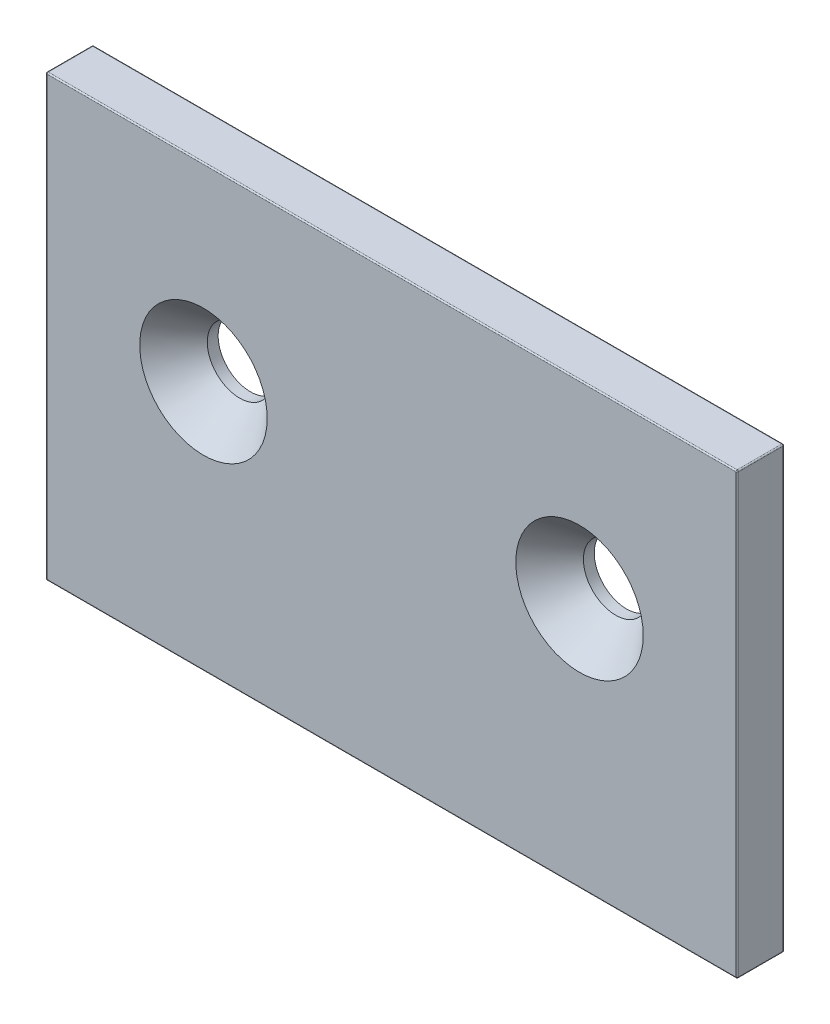
ISO-10303-21;
HEADER;
FILE_DESCRIPTION(('STEP AP214'),'2;1');
FILE_NAME('part.step','',(''),(''),'','','');
FILE_SCHEMA(('AUTOMOTIVE_DESIGN { 1 0 10303 214 1 1 1 1 }'));
ENDSEC;
DATA;
#1=APPLICATION_CONTEXT('core data for automotive mechanical design processes');
#2=APPLICATION_PROTOCOL_DEFINITION('international standard','automotive_design',2000,#1);
#3=PRODUCT_CONTEXT('',#1,'mechanical');
#4=PRODUCT('Part','Part','',(#3));
#5=PRODUCT_RELATED_PRODUCT_CATEGORY('part','',(#4));
#6=PRODUCT_DEFINITION_FORMATION('','',#4);
#7=PRODUCT_DEFINITION_CONTEXT('part definition',#1,'design');
#8=PRODUCT_DEFINITION('design','',#6,#7);
#9=PRODUCT_DEFINITION_SHAPE('','',#8);
#10=(LENGTH_UNIT() NAMED_UNIT(*) SI_UNIT(.MILLI.,.METRE.));
#11=(NAMED_UNIT(*) PLANE_ANGLE_UNIT() SI_UNIT($,.RADIAN.));
#12=(NAMED_UNIT(*) SI_UNIT($,.STERADIAN.) SOLID_ANGLE_UNIT());
#13=UNCERTAINTY_MEASURE_WITH_UNIT(LENGTH_MEASURE(1.E-05),#10,'distance_accuracy_value','');
#14=(GEOMETRIC_REPRESENTATION_CONTEXT(3) GLOBAL_UNCERTAINTY_ASSIGNED_CONTEXT((#13)) GLOBAL_UNIT_ASSIGNED_CONTEXT((#10,
#11,#12)) REPRESENTATION_CONTEXT('',''));
#15=CARTESIAN_POINT('',(0.,0.,0.));
#16=DIRECTION('',(0.,0.,1.));
#17=DIRECTION('',(1.,0.,0.));
#18=AXIS2_PLACEMENT_3D('',#15,#16,#17);
#19=CARTESIAN_POINT('',(-34.925,0.,2.3749));
#20=DIRECTION('',(1.,0.,0.));
#21=DIRECTION('',(0.,0.,-1.));
#22=AXIS2_PLACEMENT_3D('',#19,#20,#21);
#23=PLANE('',#22);
#24=DIRECTION('',(0.,-1.,0.));
#25=VECTOR('',#24,1.);
#26=CARTESIAN_POINT('',(-34.925,0.,2.2479));
#27=LINE('',#26,#25);
#28=CARTESIAN_POINT('',(-34.925,0.127,2.2479));
#29=VERTEX_POINT('',#28);
#30=CARTESIAN_POINT('',(-34.925,44.323,2.2479));
#31=VERTEX_POINT('',#30);
#32=EDGE_CURVE('E189',#29,#31,#27,.F.);
#33=ORIENTED_EDGE('',*,*,#32,.T.);
#34=DIRECTION('',(0.,0.,-1.));
#35=VECTOR('',#34,1.);
#36=CARTESIAN_POINT('',(-34.925,44.323,2.3749));
#37=LINE('',#36,#35);
#38=CARTESIAN_POINT('',(-34.925,44.323,-2.2479));
#39=VERTEX_POINT('',#38);
#40=EDGE_CURVE('E191',#31,#39,#37,.T.);
#41=ORIENTED_EDGE('',*,*,#40,.T.);
#42=DIRECTION('',(0.,-1.,0.));
#43=VECTOR('',#42,1.);
#44=CARTESIAN_POINT('',(-34.925,0.,-2.2479));
#45=LINE('',#44,#43);
#46=CARTESIAN_POINT('',(-34.925,0.127,-2.2479));
#47=VERTEX_POINT('',#46);
#48=EDGE_CURVE('E187',#39,#47,#45,.T.);
#49=ORIENTED_EDGE('',*,*,#48,.T.);
#50=DIRECTION('',(0.,0.,-1.));
#51=VECTOR('',#50,1.);
#52=CARTESIAN_POINT('',(-34.925,0.127,2.3749));
#53=LINE('',#52,#51);
#54=EDGE_CURVE('E185',#47,#29,#53,.F.);
#55=ORIENTED_EDGE('',*,*,#54,.T.);
#56=EDGE_LOOP('',(#33,#41,#49,#55));
#57=FACE_BOUND('',#56,.T.);
#58=ADVANCED_FACE('F33',(#57),#23,.F.);
#59=CARTESIAN_POINT('',(-34.925,0.,2.3749));
#60=DIRECTION('',(0.,1.,0.));
#61=DIRECTION('',(0.,0.,1.));
#62=AXIS2_PLACEMENT_3D('',#59,#60,#61);
#63=PLANE('',#62);
#64=DIRECTION('',(1.,0.,0.));
#65=VECTOR('',#64,1.);
#66=CARTESIAN_POINT('',(-34.925,0.,2.2479));
#67=LINE('',#66,#65);
#68=CARTESIAN_POINT('',(34.798,0.,2.2479));
#69=VERTEX_POINT('',#68);
#70=CARTESIAN_POINT('',(-34.798,0.,2.2479));
#71=VERTEX_POINT('',#70);
#72=EDGE_CURVE('E139',#69,#71,#67,.F.);
#73=ORIENTED_EDGE('',*,*,#72,.T.);
#74=DIRECTION('',(0.,0.,-1.));
#75=VECTOR('',#74,1.);
#76=CARTESIAN_POINT('',(-34.798,0.,2.3749));
#77=LINE('',#76,#75);
#78=CARTESIAN_POINT('',(-34.798,0.,-2.2479));
#79=VERTEX_POINT('',#78);
#80=EDGE_CURVE('E199',#71,#79,#77,.T.);
#81=ORIENTED_EDGE('',*,*,#80,.T.);
#82=DIRECTION('',(1.,0.,0.));
#83=VECTOR('',#82,1.);
#84=CARTESIAN_POINT('',(34.925,0.,-2.2479));
#85=LINE('',#84,#83);
#86=CARTESIAN_POINT('',(34.798,0.,-2.2479));
#87=VERTEX_POINT('',#86);
#88=EDGE_CURVE('E196',#79,#87,#85,.T.);
#89=ORIENTED_EDGE('',*,*,#88,.T.);
#90=DIRECTION('',(0.,0.,-1.));
#91=VECTOR('',#90,1.);
#92=CARTESIAN_POINT('',(34.798,0.,2.3749));
#93=LINE('',#92,#91);
#94=EDGE_CURVE('E194',#87,#69,#93,.F.);
#95=ORIENTED_EDGE('',*,*,#94,.T.);
#96=EDGE_LOOP('',(#73,#81,#89,#95));
#97=FACE_BOUND('',#96,.T.);
#98=ADVANCED_FACE('F305',(#97),#63,.F.);
#99=CARTESIAN_POINT('',(34.925,0.,2.3749));
#100=DIRECTION('',(-1.,0.,0.));
#101=DIRECTION('',(0.,0.,1.));
#102=AXIS2_PLACEMENT_3D('',#99,#100,#101);
#103=PLANE('',#102);
#104=DIRECTION('',(0.,1.,0.));
#105=VECTOR('',#104,1.);
#106=CARTESIAN_POINT('',(34.925,0.,2.2479));
#107=LINE('',#106,#105);
#108=CARTESIAN_POINT('',(34.925,44.323,2.2479));
#109=VERTEX_POINT('',#108);
#110=CARTESIAN_POINT('',(34.925,0.127,2.2479));
#111=VERTEX_POINT('',#110);
#112=EDGE_CURVE('E42',#109,#111,#107,.F.);
#113=ORIENTED_EDGE('',*,*,#112,.T.);
#114=DIRECTION('',(0.,0.,-1.));
#115=VECTOR('',#114,1.);
#116=CARTESIAN_POINT('',(34.925,0.127,2.3749));
#117=LINE('',#116,#115);
#118=CARTESIAN_POINT('',(34.925,0.127,-2.2479));
#119=VERTEX_POINT('',#118);
#120=EDGE_CURVE('E11',#111,#119,#117,.T.);
#121=ORIENTED_EDGE('',*,*,#120,.T.);
#122=DIRECTION('',(0.,1.,0.));
#123=VECTOR('',#122,1.);
#124=CARTESIAN_POINT('',(34.925,44.45,-2.2479));
#125=LINE('',#124,#123);
#126=CARTESIAN_POINT('',(34.925,44.323,-2.2479));
#127=VERTEX_POINT('',#126);
#128=EDGE_CURVE('E202',#119,#127,#125,.T.);
#129=ORIENTED_EDGE('',*,*,#128,.T.);
#130=DIRECTION('',(0.,0.,-1.));
#131=VECTOR('',#130,1.);
#132=CARTESIAN_POINT('',(34.925,44.323,2.3749));
#133=LINE('',#132,#131);
#134=EDGE_CURVE('E53',#127,#109,#133,.F.);
#135=ORIENTED_EDGE('',*,*,#134,.T.);
#136=EDGE_LOOP('',(#113,#121,#129,#135));
#137=FACE_BOUND('',#136,.T.);
#138=ADVANCED_FACE('F300',(#137),#103,.F.);
#139=CARTESIAN_POINT('',(-34.925,44.45,2.3749));
#140=DIRECTION('',(0.,-1.,0.));
#141=DIRECTION('',(0.,0.,-1.));
#142=AXIS2_PLACEMENT_3D('',#139,#140,#141);
#143=PLANE('',#142);
#144=DIRECTION('',(-1.,0.,0.));
#145=VECTOR('',#144,1.);
#146=CARTESIAN_POINT('',(-34.925,44.45,-2.2479));
#147=LINE('',#146,#145);
#148=CARTESIAN_POINT('',(34.798,44.45,-2.2479));
#149=VERTEX_POINT('',#148);
#150=CARTESIAN_POINT('',(-34.798,44.45,-2.2479));
#151=VERTEX_POINT('',#150);
#152=EDGE_CURVE('E169',#149,#151,#147,.T.);
#153=ORIENTED_EDGE('',*,*,#152,.T.);
#154=DIRECTION('',(0.,0.,-1.));
#155=VECTOR('',#154,1.);
#156=CARTESIAN_POINT('',(-34.798,44.45,2.3749));
#157=LINE('',#156,#155);
#158=CARTESIAN_POINT('',(-34.798,44.45,2.2479));
#159=VERTEX_POINT('',#158);
#160=EDGE_CURVE('E174',#151,#159,#157,.F.);
#161=ORIENTED_EDGE('',*,*,#160,.T.);
#162=DIRECTION('',(-1.,0.,0.));
#163=VECTOR('',#162,1.);
#164=CARTESIAN_POINT('',(-34.925,44.45,2.2479));
#165=LINE('',#164,#163);
#166=CARTESIAN_POINT('',(34.798,44.45,2.2479));
#167=VERTEX_POINT('',#166);
#168=EDGE_CURVE('E171',#159,#167,#165,.F.);
#169=ORIENTED_EDGE('',*,*,#168,.T.);
#170=DIRECTION('',(0.,0.,-1.));
#171=VECTOR('',#170,1.);
#172=CARTESIAN_POINT('',(34.798,44.45,2.3749));
#173=LINE('',#172,#171);
#174=EDGE_CURVE('E167',#167,#149,#173,.T.);
#175=ORIENTED_EDGE('',*,*,#174,.T.);
#176=EDGE_LOOP('',(#153,#161,#169,#175));
#177=FACE_BOUND('',#176,.T.);
#178=ADVANCED_FACE('F292',(#177),#143,.F.);
#179=CARTESIAN_POINT('',(0.,0.,2.3749));
#180=DIRECTION('',(0.,0.,-1.));
#181=DIRECTION('',(-1.,0.,0.));
#182=AXIS2_PLACEMENT_3D('',#179,#180,#181);
#183=PLANE('',#182);
#184=DIRECTION('',(0.,1.,0.));
#185=VECTOR('',#184,1.);
#186=CARTESIAN_POINT('',(34.798,0.,2.3749));
#187=LINE('',#186,#185);
#188=CARTESIAN_POINT('',(34.798,0.127,2.3749));
#189=VERTEX_POINT('',#188);
#190=CARTESIAN_POINT('',(34.798,44.323,2.3749));
#191=VERTEX_POINT('',#190);
#192=EDGE_CURVE('E126',#189,#191,#187,.T.);
#193=ORIENTED_EDGE('',*,*,#192,.T.);
#194=DIRECTION('',(-1.,0.,0.));
#195=VECTOR('',#194,1.);
#196=CARTESIAN_POINT('',(0.,44.323,2.3749));
#197=LINE('',#196,#195);
#198=CARTESIAN_POINT('',(-34.798,44.323,2.3749));
#199=VERTEX_POINT('',#198);
#200=EDGE_CURVE('E165',#191,#199,#197,.T.);
#201=ORIENTED_EDGE('',*,*,#200,.T.);
#202=DIRECTION('',(0.,-1.,0.));
#203=VECTOR('',#202,1.);
#204=CARTESIAN_POINT('',(-34.798,0.,2.3749));
#205=LINE('',#204,#203);
#206=CARTESIAN_POINT('',(-34.798,0.127,2.3749));
#207=VERTEX_POINT('',#206);
#208=EDGE_CURVE('E129',#199,#207,#205,.T.);
#209=ORIENTED_EDGE('',*,*,#208,.T.);
#210=DIRECTION('',(1.,0.,0.));
#211=VECTOR('',#210,1.);
#212=CARTESIAN_POINT('',(0.,0.127,2.3749));
#213=LINE('',#212,#211);
#214=EDGE_CURVE('E120',#207,#189,#213,.T.);
#215=ORIENTED_EDGE('',*,*,#214,.T.);
#216=EDGE_LOOP('',(#193,#201,#209,#215));
#217=FACE_BOUND('',#216,.T.);
#218=CARTESIAN_POINT('',(-18.9987120126599,25.3151057760743,2.3749));
#219=DIRECTION('',(0.,0.,1.));
#220=DIRECTION('',(1.,0.,0.));
#221=AXIS2_PLACEMENT_3D('',#218,#219,#220);
#222=CIRCLE('',#221,6.4389);
#223=CARTESIAN_POINT('',(-12.5598120126599,25.3151057760743,2.3749));
#224=VERTEX_POINT('',#223);
#225=EDGE_CURVE('E260',#224,#224,#222,.T.);
#226=ORIENTED_EDGE('',*,*,#225,.F.);
#227=EDGE_LOOP('',(#226));
#228=FACE_BOUND('',#227,.T.);
#229=CARTESIAN_POINT('',(18.9987120126599,25.3151057760743,2.3749));
#230=DIRECTION('',(0.,0.,1.));
#231=DIRECTION('',(1.,0.,0.));
#232=AXIS2_PLACEMENT_3D('',#229,#230,#231);
#233=CIRCLE('',#232,6.4389);
#234=CARTESIAN_POINT('',(25.4376120126599,25.3151057760743,2.3749));
#235=VERTEX_POINT('',#234);
#236=EDGE_CURVE('E276',#235,#235,#233,.T.);
#237=ORIENTED_EDGE('',*,*,#236,.F.);
#238=EDGE_LOOP('',(#237));
#239=FACE_BOUND('',#238,.T.);
#240=ADVANCED_FACE('F122',(#217,#228,#239),#183,.F.);
#241=CARTESIAN_POINT('',(0.,0.,-2.3749));
#242=DIRECTION('',(0.,0.,-1.));
#243=DIRECTION('',(-1.,0.,0.));
#244=AXIS2_PLACEMENT_3D('',#241,#242,#243);
#245=PLANE('',#244);
#246=DIRECTION('',(0.,-1.,0.));
#247=VECTOR('',#246,1.);
#248=CARTESIAN_POINT('',(-34.798,44.45,-2.3749));
#249=LINE('',#248,#247);
#250=CARTESIAN_POINT('',(-34.798,0.127,-2.3749));
#251=VERTEX_POINT('',#250);
#252=CARTESIAN_POINT('',(-34.798,44.323,-2.3749));
#253=VERTEX_POINT('',#252);
#254=EDGE_CURVE('E180',#251,#253,#249,.F.);
#255=ORIENTED_EDGE('',*,*,#254,.T.);
#256=DIRECTION('',(-1.,0.,0.));
#257=VECTOR('',#256,1.);
#258=CARTESIAN_POINT('',(34.925,44.323,-2.3749));
#259=LINE('',#258,#257);
#260=CARTESIAN_POINT('',(34.798,44.323,-2.3749));
#261=VERTEX_POINT('',#260);
#262=EDGE_CURVE('E182',#253,#261,#259,.F.);
#263=ORIENTED_EDGE('',*,*,#262,.T.);
#264=DIRECTION('',(0.,1.,0.));
#265=VECTOR('',#264,1.);
#266=CARTESIAN_POINT('',(34.798,0.,-2.3749));
#267=LINE('',#266,#265);
#268=CARTESIAN_POINT('',(34.798,0.127,-2.3749));
#269=VERTEX_POINT('',#268);
#270=EDGE_CURVE('E176',#261,#269,#267,.F.);
#271=ORIENTED_EDGE('',*,*,#270,.T.);
#272=DIRECTION('',(1.,0.,0.));
#273=VECTOR('',#272,1.);
#274=CARTESIAN_POINT('',(-34.925,0.127,-2.3749));
#275=LINE('',#274,#273);
#276=EDGE_CURVE('E178',#269,#251,#275,.F.);
#277=ORIENTED_EDGE('',*,*,#276,.T.);
#278=EDGE_LOOP('',(#255,#263,#271,#277));
#279=FACE_BOUND('',#278,.T.);
#280=CARTESIAN_POINT('',(-18.9987120126599,25.3151057760743,-2.3749));
#281=DIRECTION('',(0.,0.,1.));
#282=DIRECTION('',(1.,0.,0.));
#283=AXIS2_PLACEMENT_3D('',#280,#281,#282);
#284=CIRCLE('',#283,3.2639);
#285=CARTESIAN_POINT('',(-15.7348120126599,25.3151057760743,-2.3749));
#286=VERTEX_POINT('',#285);
#287=EDGE_CURVE('E271',#286,#286,#284,.T.);
#288=ORIENTED_EDGE('',*,*,#287,.T.);
#289=EDGE_LOOP('',(#288));
#290=FACE_BOUND('',#289,.T.);
#291=CARTESIAN_POINT('',(18.9987120126599,25.3151057760743,-2.3749));
#292=DIRECTION('',(0.,0.,1.));
#293=DIRECTION('',(1.,0.,0.));
#294=AXIS2_PLACEMENT_3D('',#291,#292,#293);
#295=CIRCLE('',#294,3.2639);
#296=CARTESIAN_POINT('',(22.2626120126599,25.3151057760743,-2.3749));
#297=VERTEX_POINT('',#296);
#298=EDGE_CURVE('E157',#297,#297,#295,.T.);
#299=ORIENTED_EDGE('',*,*,#298,.T.);
#300=EDGE_LOOP('',(#299));
#301=FACE_BOUND('',#300,.T.);
#302=ADVANCED_FACE('F291',(#279,#290,#301),#245,.T.);
#303=CARTESIAN_POINT('',(18.9987120126599,25.3151057760743,2.3749));
#304=DIRECTION('',(0.,0.,1.));
#305=DIRECTION('',(1.,0.,0.));
#306=AXIS2_PLACEMENT_3D('',#303,#304,#305);
#307=CYLINDRICAL_SURFACE('',#306,3.26389999999999);
#308=ORIENTED_EDGE('',*,*,#298,.F.);
#309=EDGE_LOOP('',(#308));
#310=FACE_BOUND('',#309,.T.);
#311=CARTESIAN_POINT('',(18.9987120126599,25.3151057760743,-1.27751969292671));
#312=DIRECTION('',(0.,0.,1.));
#313=DIRECTION('',(1.,0.,0.));
#314=AXIS2_PLACEMENT_3D('',#311,#312,#313);
#315=CIRCLE('',#314,3.26389999999999);
#316=CARTESIAN_POINT('',(22.2626120126599,25.3151057760743,-1.27751969292671));
#317=VERTEX_POINT('',#316);
#318=EDGE_CURVE('E160',#317,#317,#315,.T.);
#319=ORIENTED_EDGE('',*,*,#318,.T.);
#320=EDGE_LOOP('',(#319));
#321=FACE_BOUND('',#320,.T.);
#322=ADVANCED_FACE('F281',(#310,#321),#307,.F.);
#323=CARTESIAN_POINT('',(18.9987120126599,25.3151057760743,2.3749));
#324=DIRECTION('',(0.,0.,1.));
#325=DIRECTION('',(1.,0.,0.));
#326=AXIS2_PLACEMENT_3D('',#323,#324,#325);
#327=CONICAL_SURFACE('',#326,6.4389,0.715584993317677);
#328=ORIENTED_EDGE('',*,*,#318,.F.);
#329=EDGE_LOOP('',(#328));
#330=FACE_BOUND('',#329,.T.);
#331=ORIENTED_EDGE('',*,*,#236,.T.);
#332=EDGE_LOOP('',(#331));
#333=FACE_BOUND('',#332,.T.);
#334=ADVANCED_FACE('F283',(#330,#333),#327,.F.);
#335=CARTESIAN_POINT('',(-18.9987120126599,25.3151057760743,2.3749));
#336=DIRECTION('',(0.,0.,1.));
#337=DIRECTION('',(1.,0.,0.));
#338=AXIS2_PLACEMENT_3D('',#335,#336,#337);
#339=CYLINDRICAL_SURFACE('',#338,3.26389999999999);
#340=ORIENTED_EDGE('',*,*,#287,.F.);
#341=EDGE_LOOP('',(#340));
#342=FACE_BOUND('',#341,.T.);
#343=CARTESIAN_POINT('',(-18.9987120126599,25.3151057760743,-1.27751969292671));
#344=DIRECTION('',(0.,0.,1.));
#345=DIRECTION('',(1.,0.,0.));
#346=AXIS2_PLACEMENT_3D('',#343,#344,#345);
#347=CIRCLE('',#346,3.26389999999999);
#348=CARTESIAN_POINT('',(-15.73481201266,25.3151057760743,-1.27751969292671));
#349=VERTEX_POINT('',#348);
#350=EDGE_CURVE('E266',#349,#349,#347,.T.);
#351=ORIENTED_EDGE('',*,*,#350,.T.);
#352=EDGE_LOOP('',(#351));
#353=FACE_BOUND('',#352,.T.);
#354=ADVANCED_FACE('F286',(#342,#353),#339,.F.);
#355=CARTESIAN_POINT('',(-18.9987120126599,25.3151057760743,2.3749));
#356=DIRECTION('',(0.,0.,1.));
#357=DIRECTION('',(1.,0.,0.));
#358=AXIS2_PLACEMENT_3D('',#355,#356,#357);
#359=CONICAL_SURFACE('',#358,6.4389,0.715584993317677);
#360=ORIENTED_EDGE('',*,*,#350,.F.);
#361=EDGE_LOOP('',(#360));
#362=FACE_BOUND('',#361,.T.);
#363=ORIENTED_EDGE('',*,*,#225,.T.);
#364=EDGE_LOOP('',(#363));
#365=FACE_BOUND('',#364,.T.);
#366=ADVANCED_FACE('F385',(#362,#365),#359,.F.);
#367=CARTESIAN_POINT('',(-34.925,0.127,-2.2479));
#368=DIRECTION('',(-1.,0.,0.));
#369=DIRECTION('',(0.,0.,1.));
#370=AXIS2_PLACEMENT_3D('',#367,#368,#369);
#371=CYLINDRICAL_SURFACE('',#370,0.127);
#372=CARTESIAN_POINT('',(34.798,0.127,-2.2479));
#373=DIRECTION('',(1.,0.,0.));
#374=DIRECTION('',(0.,0.,-1.));
#375=AXIS2_PLACEMENT_3D('',#372,#373,#374);
#376=CIRCLE('',#375,0.127);
#377=EDGE_CURVE('E37',#87,#269,#376,.T.);
#378=ORIENTED_EDGE('',*,*,#377,.F.);
#379=ORIENTED_EDGE('',*,*,#88,.F.);
#380=CARTESIAN_POINT('',(-34.798,0.127,-2.2479));
#381=DIRECTION('',(-1.,0.,0.));
#382=DIRECTION('',(0.,0.,1.));
#383=AXIS2_PLACEMENT_3D('',#380,#381,#382);
#384=CIRCLE('',#383,0.127);
#385=EDGE_CURVE('E252',#251,#79,#384,.T.);
#386=ORIENTED_EDGE('',*,*,#385,.F.);
#387=ORIENTED_EDGE('',*,*,#276,.F.);
#388=EDGE_LOOP('',(#378,#379,#386,#387));
#389=FACE_BOUND('',#388,.T.);
#390=ADVANCED_FACE('F35',(#389),#371,.T.);
#391=CARTESIAN_POINT('',(34.798,0.127,-2.2479));
#392=DIRECTION('',(0.,0.,1.));
#393=DIRECTION('',(1.,0.,0.));
#394=AXIS2_PLACEMENT_3D('',#391,#392,#393);
#395=SPHERICAL_SURFACE('',#394,0.127);
#396=CARTESIAN_POINT('',(34.798,0.127,-2.2479));
#397=DIRECTION('',(0.,0.,-1.));
#398=DIRECTION('',(-1.,0.,0.));
#399=AXIS2_PLACEMENT_3D('',#396,#397,#398);
#400=CIRCLE('',#399,0.127);
#401=EDGE_CURVE('E247',#87,#119,#400,.F.);
#402=ORIENTED_EDGE('',*,*,#401,.F.);
#403=ORIENTED_EDGE('',*,*,#377,.T.);
#404=CARTESIAN_POINT('',(34.798,0.127,-2.2479));
#405=DIRECTION('',(0.,-1.,0.));
#406=DIRECTION('',(0.,0.,-1.));
#407=AXIS2_PLACEMENT_3D('',#404,#405,#406);
#408=CIRCLE('',#407,0.127);
#409=EDGE_CURVE('E250',#119,#269,#408,.F.);
#410=ORIENTED_EDGE('',*,*,#409,.F.);
#411=EDGE_LOOP('',(#402,#403,#410));
#412=FACE_BOUND('',#411,.T.);
#413=ADVANCED_FACE('F380',(#412),#395,.T.);
#414=CARTESIAN_POINT('',(-34.798,0.127,-2.2479));
#415=DIRECTION('',(0.,0.,1.));
#416=DIRECTION('',(1.,0.,0.));
#417=AXIS2_PLACEMENT_3D('',#414,#415,#416);
#418=SPHERICAL_SURFACE('',#417,0.127);
#419=CARTESIAN_POINT('',(-34.798,0.127,-2.2479));
#420=DIRECTION('',(0.,-1.,0.));
#421=DIRECTION('',(0.,0.,-1.));
#422=AXIS2_PLACEMENT_3D('',#419,#420,#421);
#423=CIRCLE('',#422,0.127);
#424=EDGE_CURVE('E242',#251,#47,#423,.F.);
#425=ORIENTED_EDGE('',*,*,#424,.F.);
#426=ORIENTED_EDGE('',*,*,#385,.T.);
#427=CARTESIAN_POINT('',(-34.798,0.127,-2.2479));
#428=DIRECTION('',(0.,0.,-1.));
#429=DIRECTION('',(-1.,0.,0.));
#430=AXIS2_PLACEMENT_3D('',#427,#428,#429);
#431=CIRCLE('',#430,0.127);
#432=EDGE_CURVE('E245',#47,#79,#431,.F.);
#433=ORIENTED_EDGE('',*,*,#432,.F.);
#434=EDGE_LOOP('',(#425,#426,#433));
#435=FACE_BOUND('',#434,.T.);
#436=ADVANCED_FACE('F377',(#435),#418,.T.);
#437=CARTESIAN_POINT('',(34.798,0.,-2.2479));
#438=DIRECTION('',(0.,-1.,0.));
#439=DIRECTION('',(0.,0.,-1.));
#440=AXIS2_PLACEMENT_3D('',#437,#438,#439);
#441=CYLINDRICAL_SURFACE('',#440,0.127);
#442=ORIENTED_EDGE('',*,*,#409,.T.);
#443=ORIENTED_EDGE('',*,*,#270,.F.);
#444=CARTESIAN_POINT('',(34.798,44.323,-2.2479));
#445=DIRECTION('',(0.,1.,0.));
#446=DIRECTION('',(0.,0.,1.));
#447=AXIS2_PLACEMENT_3D('',#444,#445,#446);
#448=CIRCLE('',#447,0.127);
#449=EDGE_CURVE('E237',#127,#261,#448,.T.);
#450=ORIENTED_EDGE('',*,*,#449,.F.);
#451=ORIENTED_EDGE('',*,*,#128,.F.);
#452=EDGE_LOOP('',(#442,#443,#450,#451));
#453=FACE_BOUND('',#452,.T.);
#454=ADVANCED_FACE('F373',(#453),#441,.T.);
#455=CARTESIAN_POINT('',(34.798,0.127,2.3749));
#456=DIRECTION('',(0.,0.,-1.));
#457=DIRECTION('',(-1.,0.,0.));
#458=AXIS2_PLACEMENT_3D('',#455,#456,#457);
#459=CYLINDRICAL_SURFACE('',#458,0.127);
#460=ORIENTED_EDGE('',*,*,#401,.T.);
#461=ORIENTED_EDGE('',*,*,#120,.F.);
#462=CARTESIAN_POINT('',(34.798,0.127,2.2479));
#463=DIRECTION('',(0.,0.,1.));
#464=DIRECTION('',(1.,0.,0.));
#465=AXIS2_PLACEMENT_3D('',#462,#463,#464);
#466=CIRCLE('',#465,0.127);
#467=EDGE_CURVE('E143',#69,#111,#466,.T.);
#468=ORIENTED_EDGE('',*,*,#467,.F.);
#469=ORIENTED_EDGE('',*,*,#94,.F.);
#470=EDGE_LOOP('',(#460,#461,#468,#469));
#471=FACE_BOUND('',#470,.T.);
#472=ADVANCED_FACE('F370',(#471),#459,.T.);
#473=CARTESIAN_POINT('',(0.,0.127,2.2479));
#474=DIRECTION('',(1.,0.,0.));
#475=DIRECTION('',(0.,0.,-1.));
#476=AXIS2_PLACEMENT_3D('',#473,#474,#475);
#477=CYLINDRICAL_SURFACE('',#476,0.127);
#478=CARTESIAN_POINT('',(-34.798,0.127,2.2479));
#479=DIRECTION('',(-1.,0.,0.));
#480=DIRECTION('',(0.,0.,1.));
#481=AXIS2_PLACEMENT_3D('',#478,#479,#480);
#482=CIRCLE('',#481,0.127);
#483=EDGE_CURVE('E144',#71,#207,#482,.T.);
#484=ORIENTED_EDGE('',*,*,#483,.F.);
#485=ORIENTED_EDGE('',*,*,#72,.F.);
#486=CARTESIAN_POINT('',(34.798,0.127,2.2479));
#487=DIRECTION('',(1.,0.,0.));
#488=DIRECTION('',(0.,0.,-1.));
#489=AXIS2_PLACEMENT_3D('',#486,#487,#488);
#490=CIRCLE('',#489,0.127);
#491=EDGE_CURVE('E136',#189,#69,#490,.T.);
#492=ORIENTED_EDGE('',*,*,#491,.F.);
#493=ORIENTED_EDGE('',*,*,#214,.F.);
#494=EDGE_LOOP('',(#484,#485,#492,#493));
#495=FACE_BOUND('',#494,.T.);
#496=ADVANCED_FACE('F138',(#495),#477,.T.);
#497=CARTESIAN_POINT('',(-34.798,0.127,2.3749));
#498=DIRECTION('',(0.,0.,-1.));
#499=DIRECTION('',(-1.,0.,0.));
#500=AXIS2_PLACEMENT_3D('',#497,#498,#499);
#501=CYLINDRICAL_SURFACE('',#500,0.127);
#502=ORIENTED_EDGE('',*,*,#432,.T.);
#503=ORIENTED_EDGE('',*,*,#80,.F.);
#504=CARTESIAN_POINT('',(-34.798,0.127,2.2479));
#505=DIRECTION('',(0.,0.,1.));
#506=DIRECTION('',(1.,0.,0.));
#507=AXIS2_PLACEMENT_3D('',#504,#505,#506);
#508=CIRCLE('',#507,0.127);
#509=EDGE_CURVE('E232',#29,#71,#508,.T.);
#510=ORIENTED_EDGE('',*,*,#509,.F.);
#511=ORIENTED_EDGE('',*,*,#54,.F.);
#512=EDGE_LOOP('',(#502,#503,#510,#511));
#513=FACE_BOUND('',#512,.T.);
#514=ADVANCED_FACE('F363',(#513),#501,.T.);
#515=CARTESIAN_POINT('',(-34.798,0.,-2.2479));
#516=DIRECTION('',(0.,1.,0.));
#517=DIRECTION('',(0.,0.,1.));
#518=AXIS2_PLACEMENT_3D('',#515,#516,#517);
#519=CYLINDRICAL_SURFACE('',#518,0.127);
#520=ORIENTED_EDGE('',*,*,#424,.T.);
#521=ORIENTED_EDGE('',*,*,#48,.F.);
#522=CARTESIAN_POINT('',(-34.798,44.323,-2.2479));
#523=DIRECTION('',(0.,1.,0.));
#524=DIRECTION('',(0.,0.,1.));
#525=AXIS2_PLACEMENT_3D('',#522,#523,#524);
#526=CIRCLE('',#525,0.127);
#527=EDGE_CURVE('E229',#253,#39,#526,.T.);
#528=ORIENTED_EDGE('',*,*,#527,.F.);
#529=ORIENTED_EDGE('',*,*,#254,.F.);
#530=EDGE_LOOP('',(#520,#521,#528,#529));
#531=FACE_BOUND('',#530,.T.);
#532=ADVANCED_FACE('F359',(#531),#519,.T.);
#533=CARTESIAN_POINT('',(-34.925,44.323,-2.2479));
#534=DIRECTION('',(1.,0.,0.));
#535=DIRECTION('',(0.,0.,-1.));
#536=AXIS2_PLACEMENT_3D('',#533,#534,#535);
#537=CYLINDRICAL_SURFACE('',#536,0.127);
#538=CARTESIAN_POINT('',(34.798,44.323,-2.2479));
#539=DIRECTION('',(1.,0.,0.));
#540=DIRECTION('',(0.,0.,-1.));
#541=AXIS2_PLACEMENT_3D('',#538,#539,#540);
#542=CIRCLE('',#541,0.127);
#543=EDGE_CURVE('E239',#261,#149,#542,.T.);
#544=ORIENTED_EDGE('',*,*,#543,.F.);
#545=ORIENTED_EDGE('',*,*,#262,.F.);
#546=CARTESIAN_POINT('',(-34.798,44.323,-2.2479));
#547=DIRECTION('',(-1.,0.,0.));
#548=DIRECTION('',(0.,0.,1.));
#549=AXIS2_PLACEMENT_3D('',#546,#547,#548);
#550=CIRCLE('',#549,0.127);
#551=EDGE_CURVE('E226',#151,#253,#550,.T.);
#552=ORIENTED_EDGE('',*,*,#551,.F.);
#553=ORIENTED_EDGE('',*,*,#152,.F.);
#554=EDGE_LOOP('',(#544,#545,#552,#553));
#555=FACE_BOUND('',#554,.T.);
#556=ADVANCED_FACE('F355',(#555),#537,.T.);
#557=CARTESIAN_POINT('',(34.798,44.323,-2.2479));
#558=DIRECTION('',(0.,0.,1.));
#559=DIRECTION('',(1.,0.,0.));
#560=AXIS2_PLACEMENT_3D('',#557,#558,#559);
#561=SPHERICAL_SURFACE('',#560,0.127);
#562=ORIENTED_EDGE('',*,*,#449,.T.);
#563=ORIENTED_EDGE('',*,*,#543,.T.);
#564=CARTESIAN_POINT('',(34.798,44.323,-2.2479));
#565=DIRECTION('',(0.,0.,-1.));
#566=DIRECTION('',(-1.,0.,0.));
#567=AXIS2_PLACEMENT_3D('',#564,#565,#566);
#568=CIRCLE('',#567,0.127);
#569=EDGE_CURVE('E150',#127,#149,#568,.F.);
#570=ORIENTED_EDGE('',*,*,#569,.F.);
#571=EDGE_LOOP('',(#562,#563,#570));
#572=FACE_BOUND('',#571,.T.);
#573=ADVANCED_FACE('F352',(#572),#561,.T.);
#574=CARTESIAN_POINT('',(34.798,0.127,2.2479));
#575=DIRECTION('',(0.,0.,1.));
#576=DIRECTION('',(1.,0.,0.));
#577=AXIS2_PLACEMENT_3D('',#574,#575,#576);
#578=SPHERICAL_SURFACE('',#577,0.127);
#579=ORIENTED_EDGE('',*,*,#491,.T.);
#580=ORIENTED_EDGE('',*,*,#467,.T.);
#581=CARTESIAN_POINT('',(34.798,0.127,2.2479));
#582=DIRECTION('',(0.,-1.,0.));
#583=DIRECTION('',(0.,0.,-1.));
#584=AXIS2_PLACEMENT_3D('',#581,#582,#583);
#585=CIRCLE('',#584,0.127);
#586=EDGE_CURVE('E147',#189,#111,#585,.F.);
#587=ORIENTED_EDGE('',*,*,#586,.F.);
#588=EDGE_LOOP('',(#579,#580,#587));
#589=FACE_BOUND('',#588,.T.);
#590=ADVANCED_FACE('F148',(#589),#578,.T.);
#591=CARTESIAN_POINT('',(-34.798,0.127,2.2479));
#592=DIRECTION('',(0.,0.,1.));
#593=DIRECTION('',(1.,0.,0.));
#594=AXIS2_PLACEMENT_3D('',#591,#592,#593);
#595=SPHERICAL_SURFACE('',#594,0.127);
#596=ORIENTED_EDGE('',*,*,#509,.T.);
#597=ORIENTED_EDGE('',*,*,#483,.T.);
#598=CARTESIAN_POINT('',(-34.798,0.127,2.2479));
#599=DIRECTION('',(0.,-1.,0.));
#600=DIRECTION('',(0.,0.,-1.));
#601=AXIS2_PLACEMENT_3D('',#598,#599,#600);
#602=CIRCLE('',#601,0.127);
#603=EDGE_CURVE('E151',#29,#207,#602,.F.);
#604=ORIENTED_EDGE('',*,*,#603,.F.);
#605=EDGE_LOOP('',(#596,#597,#604));
#606=FACE_BOUND('',#605,.T.);
#607=ADVANCED_FACE('F345',(#606),#595,.T.);
#608=CARTESIAN_POINT('',(-34.798,44.323,-2.2479));
#609=DIRECTION('',(0.,0.,1.));
#610=DIRECTION('',(1.,0.,0.));
#611=AXIS2_PLACEMENT_3D('',#608,#609,#610);
#612=SPHERICAL_SURFACE('',#611,0.127);
#613=ORIENTED_EDGE('',*,*,#551,.T.);
#614=ORIENTED_EDGE('',*,*,#527,.T.);
#615=CARTESIAN_POINT('',(-34.798,44.323,-2.2479));
#616=DIRECTION('',(0.,0.,-1.));
#617=DIRECTION('',(-1.,0.,0.));
#618=AXIS2_PLACEMENT_3D('',#615,#616,#617);
#619=CIRCLE('',#618,0.127);
#620=EDGE_CURVE('E220',#151,#39,#619,.F.);
#621=ORIENTED_EDGE('',*,*,#620,.F.);
#622=EDGE_LOOP('',(#613,#614,#621));
#623=FACE_BOUND('',#622,.T.);
#624=ADVANCED_FACE('F341',(#623),#612,.T.);
#625=CARTESIAN_POINT('',(34.798,44.323,2.3749));
#626=DIRECTION('',(0.,0.,-1.));
#627=DIRECTION('',(-1.,0.,0.));
#628=AXIS2_PLACEMENT_3D('',#625,#626,#627);
#629=CYLINDRICAL_SURFACE('',#628,0.127);
#630=ORIENTED_EDGE('',*,*,#569,.T.);
#631=ORIENTED_EDGE('',*,*,#174,.F.);
#632=CARTESIAN_POINT('',(34.798,44.323,2.2479));
#633=DIRECTION('',(0.,0.,1.));
#634=DIRECTION('',(1.,0.,0.));
#635=AXIS2_PLACEMENT_3D('',#632,#633,#634);
#636=CIRCLE('',#635,0.127);
#637=EDGE_CURVE('E217',#109,#167,#636,.T.);
#638=ORIENTED_EDGE('',*,*,#637,.F.);
#639=ORIENTED_EDGE('',*,*,#134,.F.);
#640=EDGE_LOOP('',(#630,#631,#638,#639));
#641=FACE_BOUND('',#640,.T.);
#642=ADVANCED_FACE('F338',(#641),#629,.T.);
#643=CARTESIAN_POINT('',(34.798,0.,2.2479));
#644=DIRECTION('',(0.,1.,0.));
#645=DIRECTION('',(0.,0.,1.));
#646=AXIS2_PLACEMENT_3D('',#643,#644,#645);
#647=CYLINDRICAL_SURFACE('',#646,0.127);
#648=ORIENTED_EDGE('',*,*,#586,.T.);
#649=ORIENTED_EDGE('',*,*,#112,.F.);
#650=CARTESIAN_POINT('',(34.798,44.323,2.2479));
#651=DIRECTION('',(0.,1.,0.));
#652=DIRECTION('',(0.,0.,1.));
#653=AXIS2_PLACEMENT_3D('',#650,#651,#652);
#654=CIRCLE('',#653,0.127);
#655=EDGE_CURVE('E155',#191,#109,#654,.T.);
#656=ORIENTED_EDGE('',*,*,#655,.F.);
#657=ORIENTED_EDGE('',*,*,#192,.F.);
#658=EDGE_LOOP('',(#648,#649,#656,#657));
#659=FACE_BOUND('',#658,.T.);
#660=ADVANCED_FACE('F153',(#659),#647,.T.);
#661=CARTESIAN_POINT('',(-34.798,0.,2.2479));
#662=DIRECTION('',(0.,-1.,0.));
#663=DIRECTION('',(0.,0.,-1.));
#664=AXIS2_PLACEMENT_3D('',#661,#662,#663);
#665=CYLINDRICAL_SURFACE('',#664,0.127);
#666=ORIENTED_EDGE('',*,*,#603,.T.);
#667=ORIENTED_EDGE('',*,*,#208,.F.);
#668=CARTESIAN_POINT('',(-34.798,44.323,2.2479));
#669=DIRECTION('',(0.,1.,0.));
#670=DIRECTION('',(0.,0.,1.));
#671=AXIS2_PLACEMENT_3D('',#668,#669,#670);
#672=CIRCLE('',#671,0.127);
#673=EDGE_CURVE('E213',#31,#199,#672,.T.);
#674=ORIENTED_EDGE('',*,*,#673,.F.);
#675=ORIENTED_EDGE('',*,*,#32,.F.);
#676=EDGE_LOOP('',(#666,#667,#674,#675));
#677=FACE_BOUND('',#676,.T.);
#678=ADVANCED_FACE('F331',(#677),#665,.T.);
#679=CARTESIAN_POINT('',(-34.798,44.323,2.3749));
#680=DIRECTION('',(0.,0.,-1.));
#681=DIRECTION('',(-1.,0.,0.));
#682=AXIS2_PLACEMENT_3D('',#679,#680,#681);
#683=CYLINDRICAL_SURFACE('',#682,0.127);
#684=ORIENTED_EDGE('',*,*,#620,.T.);
#685=ORIENTED_EDGE('',*,*,#40,.F.);
#686=CARTESIAN_POINT('',(-34.798,44.323,2.2479));
#687=DIRECTION('',(0.,0.,1.));
#688=DIRECTION('',(1.,0.,0.));
#689=AXIS2_PLACEMENT_3D('',#686,#687,#688);
#690=CIRCLE('',#689,0.127);
#691=EDGE_CURVE('E210',#159,#31,#690,.T.);
#692=ORIENTED_EDGE('',*,*,#691,.F.);
#693=ORIENTED_EDGE('',*,*,#160,.F.);
#694=EDGE_LOOP('',(#684,#685,#692,#693));
#695=FACE_BOUND('',#694,.T.);
#696=ADVANCED_FACE('F327',(#695),#683,.T.);
#697=CARTESIAN_POINT('',(34.798,44.323,2.2479));
#698=DIRECTION('',(0.,0.,1.));
#699=DIRECTION('',(1.,0.,0.));
#700=AXIS2_PLACEMENT_3D('',#697,#698,#699);
#701=SPHERICAL_SURFACE('',#700,0.127);
#702=ORIENTED_EDGE('',*,*,#655,.T.);
#703=ORIENTED_EDGE('',*,*,#637,.T.);
#704=CARTESIAN_POINT('',(34.798,44.323,2.2479));
#705=DIRECTION('',(1.,0.,0.));
#706=DIRECTION('',(0.,0.,-1.));
#707=AXIS2_PLACEMENT_3D('',#704,#705,#706);
#708=CIRCLE('',#707,0.127);
#709=EDGE_CURVE('E208',#191,#167,#708,.F.);
#710=ORIENTED_EDGE('',*,*,#709,.F.);
#711=EDGE_LOOP('',(#702,#703,#710));
#712=FACE_BOUND('',#711,.T.);
#713=ADVANCED_FACE('F323',(#712),#701,.T.);
#714=CARTESIAN_POINT('',(-34.798,44.323,2.2479));
#715=DIRECTION('',(0.,0.,1.));
#716=DIRECTION('',(1.,0.,0.));
#717=AXIS2_PLACEMENT_3D('',#714,#715,#716);
#718=SPHERICAL_SURFACE('',#717,0.127);
#719=ORIENTED_EDGE('',*,*,#691,.T.);
#720=ORIENTED_EDGE('',*,*,#673,.T.);
#721=CARTESIAN_POINT('',(-34.798,44.323,2.2479));
#722=DIRECTION('',(-1.,0.,0.));
#723=DIRECTION('',(0.,0.,1.));
#724=AXIS2_PLACEMENT_3D('',#721,#722,#723);
#725=CIRCLE('',#724,0.127);
#726=EDGE_CURVE('E206',#159,#199,#725,.F.);
#727=ORIENTED_EDGE('',*,*,#726,.F.);
#728=EDGE_LOOP('',(#719,#720,#727));
#729=FACE_BOUND('',#728,.T.);
#730=ADVANCED_FACE('F319',(#729),#718,.T.);
#731=CARTESIAN_POINT('',(0.,44.323,2.2479));
#732=DIRECTION('',(-1.,0.,0.));
#733=DIRECTION('',(0.,0.,1.));
#734=AXIS2_PLACEMENT_3D('',#731,#732,#733);
#735=CYLINDRICAL_SURFACE('',#734,0.127);
#736=ORIENTED_EDGE('',*,*,#709,.T.);
#737=ORIENTED_EDGE('',*,*,#168,.F.);
#738=ORIENTED_EDGE('',*,*,#726,.T.);
#739=ORIENTED_EDGE('',*,*,#200,.F.);
#740=EDGE_LOOP('',(#736,#737,#738,#739));
#741=FACE_BOUND('',#740,.T.);
#742=ADVANCED_FACE('F316',(#741),#735,.T.);
#743=CLOSED_SHELL('',(#58,#98,#138,#178,#240,#302,#322,#334,#354,#366,#390,#413,#436,#454,#472,
#496,#514,#532,#556,#573,#590,#607,#624,#642,#660,#678,#696,#713,#730,#742));
#744=MANIFOLD_SOLID_BREP('B2',#743);
#745=ADVANCED_BREP_SHAPE_REPRESENTATION('',(#18,#744),#14);
#746=SHAPE_DEFINITION_REPRESENTATION(#9,#745);
ENDSEC;
END-ISO-10303-21;
